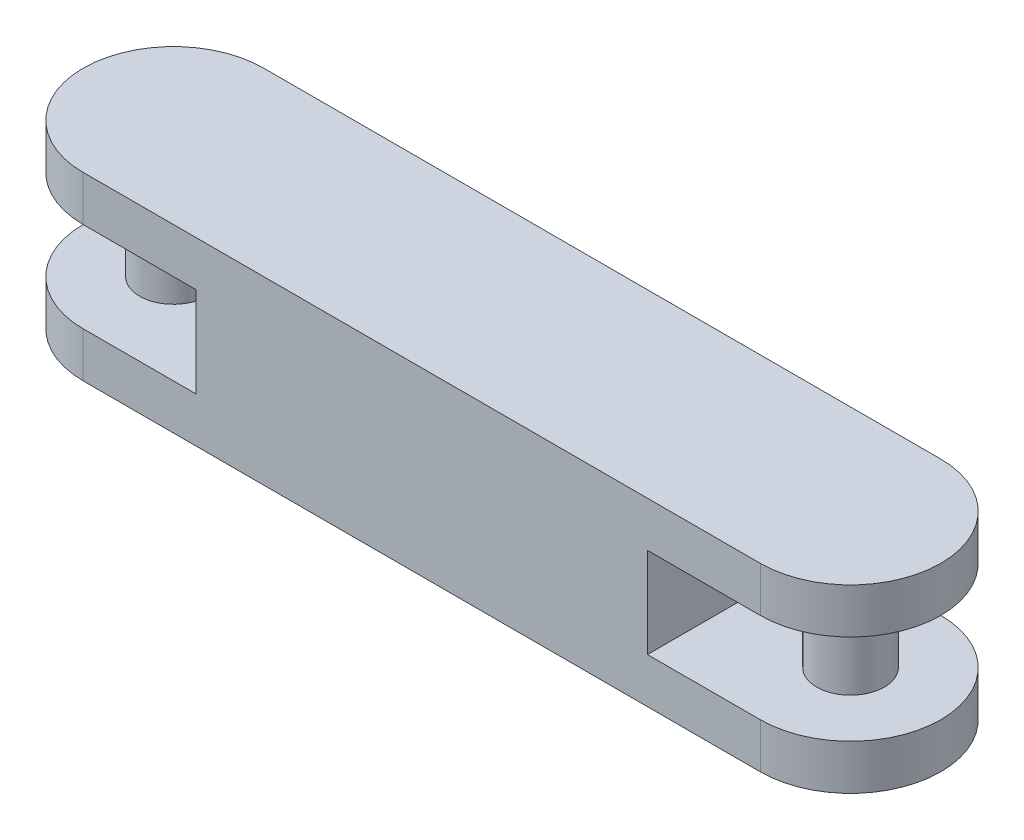
ISO-10303-21;
HEADER;
FILE_DESCRIPTION(('STEP AP214'),'2;1');
FILE_NAME('part.step','',(''),(''),'','','');
FILE_SCHEMA(('AUTOMOTIVE_DESIGN { 1 0 10303 214 1 1 1 1 }'));
ENDSEC;
DATA;
#1=APPLICATION_CONTEXT('core data for automotive mechanical design processes');
#2=APPLICATION_PROTOCOL_DEFINITION('international standard','automotive_design',2000,#1);
#3=PRODUCT_CONTEXT('',#1,'mechanical');
#4=PRODUCT('Part','Part','',(#3));
#5=PRODUCT_RELATED_PRODUCT_CATEGORY('part','',(#4));
#6=PRODUCT_DEFINITION_FORMATION('','',#4);
#7=PRODUCT_DEFINITION_CONTEXT('part definition',#1,'design');
#8=PRODUCT_DEFINITION('design','',#6,#7);
#9=PRODUCT_DEFINITION_SHAPE('','',#8);
#10=(LENGTH_UNIT() NAMED_UNIT(*) SI_UNIT(.MILLI.,.METRE.));
#11=(NAMED_UNIT(*) PLANE_ANGLE_UNIT() SI_UNIT($,.RADIAN.));
#12=(NAMED_UNIT(*) SI_UNIT($,.STERADIAN.) SOLID_ANGLE_UNIT());
#13=UNCERTAINTY_MEASURE_WITH_UNIT(LENGTH_MEASURE(1.E-05),#10,'distance_accuracy_value','');
#14=(GEOMETRIC_REPRESENTATION_CONTEXT(3) GLOBAL_UNCERTAINTY_ASSIGNED_CONTEXT((#13)) GLOBAL_UNIT_ASSIGNED_CONTEXT((#10,
#11,#12)) REPRESENTATION_CONTEXT('',''));
#15=CARTESIAN_POINT('',(0.,0.,0.));
#16=DIRECTION('',(0.,0.,1.));
#17=DIRECTION('',(1.,0.,0.));
#18=AXIS2_PLACEMENT_3D('',#15,#16,#17);
#19=CARTESIAN_POINT('',(0.,40.,0.));
#20=DIRECTION('',(0.,-1.,0.));
#21=DIRECTION('',(0.,0.,-1.));
#22=AXIS2_PLACEMENT_3D('',#19,#20,#21);
#23=CYLINDRICAL_SURFACE('',#22,40.);
#24=CARTESIAN_POINT('',(0.,20.,0.));
#25=DIRECTION('',(0.,-1.,0.));
#26=DIRECTION('',(1.,0.,0.));
#27=AXIS2_PLACEMENT_3D('',#24,#25,#26);
#28=CIRCLE('',#27,40.);
#29=CARTESIAN_POINT('',(0.,20.,40.));
#30=VERTEX_POINT('',#29);
#31=CARTESIAN_POINT('',(0.,20.,-40.));
#32=VERTEX_POINT('',#31);
#33=EDGE_CURVE('E195',#30,#32,#28,.T.);
#34=ORIENTED_EDGE('',*,*,#33,.F.);
#35=DIRECTION('',(0.,-1.,0.));
#36=VECTOR('',#35,1.);
#37=CARTESIAN_POINT('',(0.,40.,40.));
#38=LINE('',#37,#36);
#39=CARTESIAN_POINT('',(0.,40.,40.));
#40=VERTEX_POINT('',#39);
#41=EDGE_CURVE('E158',#40,#30,#38,.T.);
#42=ORIENTED_EDGE('',*,*,#41,.F.);
#43=CARTESIAN_POINT('',(0.,40.,0.));
#44=DIRECTION('',(0.,1.,0.));
#45=DIRECTION('',(0.,0.,1.));
#46=AXIS2_PLACEMENT_3D('',#43,#44,#45);
#47=CIRCLE('',#46,40.);
#48=CARTESIAN_POINT('',(0.,40.,-40.));
#49=VERTEX_POINT('',#48);
#50=EDGE_CURVE('E175',#49,#40,#47,.T.);
#51=ORIENTED_EDGE('',*,*,#50,.F.);
#52=DIRECTION('',(0.,-1.,0.));
#53=VECTOR('',#52,1.);
#54=CARTESIAN_POINT('',(0.,40.,-40.));
#55=LINE('',#54,#53);
#56=EDGE_CURVE('E170',#49,#32,#55,.T.);
#57=ORIENTED_EDGE('',*,*,#56,.T.);
#58=EDGE_LOOP('',(#34,#42,#51,#57));
#59=FACE_BOUND('',#58,.T.);
#60=ADVANCED_FACE('F39',(#59),#23,.T.);
#61=CARTESIAN_POINT('',(300.,40.,0.));
#62=DIRECTION('',(0.,-1.,0.));
#63=DIRECTION('',(0.,0.,-1.));
#64=AXIS2_PLACEMENT_3D('',#61,#62,#63);
#65=CYLINDRICAL_SURFACE('',#64,40.);
#66=CARTESIAN_POINT('',(300.,-20.,0.));
#67=DIRECTION('',(0.,1.,0.));
#68=DIRECTION('',(-1.,0.,0.));
#69=AXIS2_PLACEMENT_3D('',#66,#67,#68);
#70=CIRCLE('',#69,40.);
#71=CARTESIAN_POINT('',(300.,-20.,40.));
#72=VERTEX_POINT('',#71);
#73=CARTESIAN_POINT('',(300.,-20.,-40.));
#74=VERTEX_POINT('',#73);
#75=EDGE_CURVE('E199',#72,#74,#70,.T.);
#76=ORIENTED_EDGE('',*,*,#75,.F.);
#77=DIRECTION('',(0.,-1.,0.));
#78=VECTOR('',#77,1.);
#79=CARTESIAN_POINT('',(300.,40.,40.));
#80=LINE('',#79,#78);
#81=CARTESIAN_POINT('',(300.,-40.,40.));
#82=VERTEX_POINT('',#81);
#83=EDGE_CURVE('E165',#72,#82,#80,.T.);
#84=ORIENTED_EDGE('',*,*,#83,.T.);
#85=CARTESIAN_POINT('',(300.,-40.,0.));
#86=DIRECTION('',(0.,1.,0.));
#87=DIRECTION('',(0.,0.,1.));
#88=AXIS2_PLACEMENT_3D('',#85,#86,#87);
#89=CIRCLE('',#88,40.);
#90=CARTESIAN_POINT('',(300.,-40.,-40.));
#91=VERTEX_POINT('',#90);
#92=EDGE_CURVE('E176',#82,#91,#89,.T.);
#93=ORIENTED_EDGE('',*,*,#92,.T.);
#94=DIRECTION('',(0.,-1.,0.));
#95=VECTOR('',#94,1.);
#96=CARTESIAN_POINT('',(300.,40.,-40.));
#97=LINE('',#96,#95);
#98=EDGE_CURVE('E169',#74,#91,#97,.T.);
#99=ORIENTED_EDGE('',*,*,#98,.F.);
#100=EDGE_LOOP('',(#76,#84,#93,#99));
#101=FACE_BOUND('',#100,.T.);
#102=ADVANCED_FACE('F244',(#101),#65,.T.);
#103=CARTESIAN_POINT('',(0.,-20.,40.));
#104=VERTEX_POINT('',#103);
#105=CARTESIAN_POINT('',(0.,-40.,40.));
#106=VERTEX_POINT('',#105);
#107=EDGE_CURVE('E161',#104,#106,#38,.T.);
#108=ORIENTED_EDGE('',*,*,#107,.F.);
#109=CARTESIAN_POINT('',(0.,-20.,0.));
#110=DIRECTION('',(0.,-1.,0.));
#111=DIRECTION('',(1.,0.,0.));
#112=AXIS2_PLACEMENT_3D('',#109,#110,#111);
#113=CIRCLE('',#112,40.);
#114=CARTESIAN_POINT('',(0.,-20.,-40.));
#115=VERTEX_POINT('',#114);
#116=EDGE_CURVE('E185',#104,#115,#113,.T.);
#117=ORIENTED_EDGE('',*,*,#116,.T.);
#118=CARTESIAN_POINT('',(0.,-40.,-40.));
#119=VERTEX_POINT('',#118);
#120=EDGE_CURVE('E147',#115,#119,#55,.T.);
#121=ORIENTED_EDGE('',*,*,#120,.T.);
#122=CARTESIAN_POINT('',(0.,-40.,0.));
#123=DIRECTION('',(0.,1.,0.));
#124=DIRECTION('',(0.,0.,1.));
#125=AXIS2_PLACEMENT_3D('',#122,#123,#124);
#126=CIRCLE('',#125,40.);
#127=EDGE_CURVE('E182',#119,#106,#126,.T.);
#128=ORIENTED_EDGE('',*,*,#127,.T.);
#129=EDGE_LOOP('',(#108,#117,#121,#128));
#130=FACE_BOUND('',#129,.T.);
#131=ADVANCED_FACE('F41',(#130),#23,.T.);
#132=CARTESIAN_POINT('',(0.,40.,40.));
#133=DIRECTION('',(0.,0.,-1.));
#134=DIRECTION('',(-1.,0.,0.));
#135=AXIS2_PLACEMENT_3D('',#132,#133,#134);
#136=PLANE('',#135);
#137=DIRECTION('',(0.,-1.,0.));
#138=VECTOR('',#137,1.);
#139=CARTESIAN_POINT('',(50.,20.,40.));
#140=LINE('',#139,#138);
#141=CARTESIAN_POINT('',(50.,20.,40.));
#142=VERTEX_POINT('',#141);
#143=CARTESIAN_POINT('',(50.,-20.,40.));
#144=VERTEX_POINT('',#143);
#145=EDGE_CURVE('E219',#142,#144,#140,.T.);
#146=ORIENTED_EDGE('',*,*,#145,.T.);
#147=DIRECTION('',(1.,0.,0.));
#148=VECTOR('',#147,1.);
#149=CARTESIAN_POINT('',(-40.,-20.,40.));
#150=LINE('',#149,#148);
#151=EDGE_CURVE('E143',#104,#144,#150,.T.);
#152=ORIENTED_EDGE('',*,*,#151,.F.);
#153=ORIENTED_EDGE('',*,*,#107,.T.);
#154=DIRECTION('',(1.,0.,0.));
#155=VECTOR('',#154,1.);
#156=CARTESIAN_POINT('',(0.,-40.,40.));
#157=LINE('',#156,#155);
#158=EDGE_CURVE('E179',#106,#82,#157,.T.);
#159=ORIENTED_EDGE('',*,*,#158,.T.);
#160=ORIENTED_EDGE('',*,*,#83,.F.);
#161=DIRECTION('',(-1.,0.,0.));
#162=VECTOR('',#161,1.);
#163=CARTESIAN_POINT('',(340.,-20.,40.));
#164=LINE('',#163,#162);
#165=CARTESIAN_POINT('',(250.,-20.,40.));
#166=VERTEX_POINT('',#165);
#167=EDGE_CURVE('E206',#72,#166,#164,.T.);
#168=ORIENTED_EDGE('',*,*,#167,.T.);
#169=DIRECTION('',(0.,1.,0.));
#170=VECTOR('',#169,1.);
#171=CARTESIAN_POINT('',(250.,-20.,40.));
#172=LINE('',#171,#170);
#173=CARTESIAN_POINT('',(250.,20.,40.));
#174=VERTEX_POINT('',#173);
#175=EDGE_CURVE('E209',#166,#174,#172,.T.);
#176=ORIENTED_EDGE('',*,*,#175,.T.);
#177=DIRECTION('',(-1.,0.,0.));
#178=VECTOR('',#177,1.);
#179=CARTESIAN_POINT('',(340.,20.,40.));
#180=LINE('',#179,#178);
#181=CARTESIAN_POINT('',(300.,20.,40.));
#182=VERTEX_POINT('',#181);
#183=EDGE_CURVE('E212',#182,#174,#180,.T.);
#184=ORIENTED_EDGE('',*,*,#183,.F.);
#185=CARTESIAN_POINT('',(300.,40.,40.));
#186=VERTEX_POINT('',#185);
#187=EDGE_CURVE('E162',#186,#182,#80,.T.);
#188=ORIENTED_EDGE('',*,*,#187,.F.);
#189=DIRECTION('',(1.,0.,0.));
#190=VECTOR('',#189,1.);
#191=CARTESIAN_POINT('',(0.,40.,40.));
#192=LINE('',#191,#190);
#193=EDGE_CURVE('E190',#40,#186,#192,.T.);
#194=ORIENTED_EDGE('',*,*,#193,.F.);
#195=ORIENTED_EDGE('',*,*,#41,.T.);
#196=DIRECTION('',(1.,0.,0.));
#197=VECTOR('',#196,1.);
#198=CARTESIAN_POINT('',(-40.,20.,40.));
#199=LINE('',#198,#197);
#200=EDGE_CURVE('E135',#30,#142,#199,.T.);
#201=ORIENTED_EDGE('',*,*,#200,.T.);
#202=EDGE_LOOP('',(#146,#152,#153,#159,#160,#168,#176,#184,#188,#194,#195,#201));
#203=FACE_BOUND('',#202,.T.);
#204=ADVANCED_FACE('F254',(#203),#136,.F.);
#205=ORIENTED_EDGE('',*,*,#187,.T.);
#206=CARTESIAN_POINT('',(300.,20.,0.));
#207=DIRECTION('',(0.,1.,0.));
#208=DIRECTION('',(-1.,0.,0.));
#209=AXIS2_PLACEMENT_3D('',#206,#207,#208);
#210=CIRCLE('',#209,40.);
#211=CARTESIAN_POINT('',(300.,20.,-40.));
#212=VERTEX_POINT('',#211);
#213=EDGE_CURVE('E197',#182,#212,#210,.T.);
#214=ORIENTED_EDGE('',*,*,#213,.T.);
#215=CARTESIAN_POINT('',(300.,40.,-40.));
#216=VERTEX_POINT('',#215);
#217=EDGE_CURVE('E166',#216,#212,#97,.T.);
#218=ORIENTED_EDGE('',*,*,#217,.F.);
#219=CARTESIAN_POINT('',(300.,40.,0.));
#220=DIRECTION('',(0.,1.,0.));
#221=DIRECTION('',(0.,0.,1.));
#222=AXIS2_PLACEMENT_3D('',#219,#220,#221);
#223=CIRCLE('',#222,40.);
#224=EDGE_CURVE('E188',#186,#216,#223,.T.);
#225=ORIENTED_EDGE('',*,*,#224,.F.);
#226=EDGE_LOOP('',(#205,#214,#218,#225));
#227=FACE_BOUND('',#226,.T.);
#228=ADVANCED_FACE('F251',(#227),#65,.T.);
#229=CARTESIAN_POINT('',(0.,40.,-40.));
#230=DIRECTION('',(0.,0.,1.));
#231=DIRECTION('',(1.,0.,0.));
#232=AXIS2_PLACEMENT_3D('',#229,#230,#231);
#233=PLANE('',#232);
#234=ORIENTED_EDGE('',*,*,#120,.F.);
#235=DIRECTION('',(1.,0.,0.));
#236=VECTOR('',#235,1.);
#237=CARTESIAN_POINT('',(0.,-20.,-40.));
#238=LINE('',#237,#236);
#239=CARTESIAN_POINT('',(50.,-20.,-40.));
#240=VERTEX_POINT('',#239);
#241=EDGE_CURVE('E140',#115,#240,#238,.T.);
#242=ORIENTED_EDGE('',*,*,#241,.T.);
#243=DIRECTION('',(0.,-1.,0.));
#244=VECTOR('',#243,1.);
#245=CARTESIAN_POINT('',(50.,20.,-40.));
#246=LINE('',#245,#244);
#247=CARTESIAN_POINT('',(50.,20.,-40.));
#248=VERTEX_POINT('',#247);
#249=EDGE_CURVE('E127',#248,#240,#246,.T.);
#250=ORIENTED_EDGE('',*,*,#249,.F.);
#251=DIRECTION('',(1.,0.,0.));
#252=VECTOR('',#251,1.);
#253=CARTESIAN_POINT('',(0.,20.,-40.));
#254=LINE('',#253,#252);
#255=EDGE_CURVE('E148',#32,#248,#254,.T.);
#256=ORIENTED_EDGE('',*,*,#255,.F.);
#257=ORIENTED_EDGE('',*,*,#56,.F.);
#258=DIRECTION('',(-1.,0.,0.));
#259=VECTOR('',#258,1.);
#260=CARTESIAN_POINT('',(0.,40.,-40.));
#261=LINE('',#260,#259);
#262=EDGE_CURVE('E186',#216,#49,#261,.T.);
#263=ORIENTED_EDGE('',*,*,#262,.F.);
#264=ORIENTED_EDGE('',*,*,#217,.T.);
#265=DIRECTION('',(-1.,0.,0.));
#266=VECTOR('',#265,1.);
#267=CARTESIAN_POINT('',(0.,20.,-40.));
#268=LINE('',#267,#266);
#269=CARTESIAN_POINT('',(250.,20.,-40.));
#270=VERTEX_POINT('',#269);
#271=EDGE_CURVE('E151',#212,#270,#268,.T.);
#272=ORIENTED_EDGE('',*,*,#271,.T.);
#273=DIRECTION('',(0.,1.,0.));
#274=VECTOR('',#273,1.);
#275=CARTESIAN_POINT('',(250.,-20.,-40.));
#276=LINE('',#275,#274);
#277=CARTESIAN_POINT('',(250.,-20.,-40.));
#278=VERTEX_POINT('',#277);
#279=EDGE_CURVE('E204',#278,#270,#276,.T.);
#280=ORIENTED_EDGE('',*,*,#279,.F.);
#281=DIRECTION('',(-1.,0.,0.));
#282=VECTOR('',#281,1.);
#283=CARTESIAN_POINT('',(0.,-20.,-40.));
#284=LINE('',#283,#282);
#285=EDGE_CURVE('E156',#74,#278,#284,.T.);
#286=ORIENTED_EDGE('',*,*,#285,.F.);
#287=ORIENTED_EDGE('',*,*,#98,.T.);
#288=DIRECTION('',(-1.,0.,0.));
#289=VECTOR('',#288,1.);
#290=CARTESIAN_POINT('',(0.,-40.,-40.));
#291=LINE('',#290,#289);
#292=EDGE_CURVE('E173',#91,#119,#291,.T.);
#293=ORIENTED_EDGE('',*,*,#292,.T.);
#294=EDGE_LOOP('',(#234,#242,#250,#256,#257,#263,#264,#272,#280,#286,#287,#293));
#295=FACE_BOUND('',#294,.T.);
#296=ADVANCED_FACE('F145',(#295),#233,.F.);
#297=CARTESIAN_POINT('',(0.,40.,0.));
#298=DIRECTION('',(0.,1.,0.));
#299=DIRECTION('',(0.,0.,1.));
#300=AXIS2_PLACEMENT_3D('',#297,#298,#299);
#301=PLANE('',#300);
#302=ORIENTED_EDGE('',*,*,#50,.T.);
#303=ORIENTED_EDGE('',*,*,#193,.T.);
#304=ORIENTED_EDGE('',*,*,#224,.T.);
#305=ORIENTED_EDGE('',*,*,#262,.T.);
#306=EDGE_LOOP('',(#302,#303,#304,#305));
#307=FACE_BOUND('',#306,.T.);
#308=ADVANCED_FACE('F289',(#307),#301,.T.);
#309=CARTESIAN_POINT('',(0.,-40.,0.));
#310=DIRECTION('',(0.,1.,0.));
#311=DIRECTION('',(0.,0.,1.));
#312=AXIS2_PLACEMENT_3D('',#309,#310,#311);
#313=PLANE('',#312);
#314=ORIENTED_EDGE('',*,*,#127,.F.);
#315=ORIENTED_EDGE('',*,*,#292,.F.);
#316=ORIENTED_EDGE('',*,*,#92,.F.);
#317=ORIENTED_EDGE('',*,*,#158,.F.);
#318=EDGE_LOOP('',(#314,#315,#316,#317));
#319=FACE_BOUND('',#318,.T.);
#320=ADVANCED_FACE('F266',(#319),#313,.F.);
#321=CARTESIAN_POINT('',(340.,20.,-40.));
#322=DIRECTION('',(0.,1.,0.));
#323=DIRECTION('',(-1.,0.,0.));
#324=AXIS2_PLACEMENT_3D('',#321,#322,#323);
#325=PLANE('',#324);
#326=CARTESIAN_POINT('',(300.,20.,0.));
#327=DIRECTION('',(0.,1.,0.));
#328=DIRECTION('',(-1.,0.,0.));
#329=AXIS2_PLACEMENT_3D('',#326,#327,#328);
#330=CIRCLE('',#329,15.);
#331=CARTESIAN_POINT('',(285.,20.,0.));
#332=VERTEX_POINT('',#331);
#333=EDGE_CURVE('E214',#332,#332,#330,.T.);
#334=ORIENTED_EDGE('',*,*,#333,.T.);
#335=EDGE_LOOP('',(#334));
#336=FACE_BOUND('',#335,.T.);
#337=ORIENTED_EDGE('',*,*,#183,.T.);
#338=DIRECTION('',(0.,0.,1.));
#339=VECTOR('',#338,1.);
#340=CARTESIAN_POINT('',(250.,20.,-40.));
#341=LINE('',#340,#339);
#342=EDGE_CURVE('E201',#270,#174,#341,.T.);
#343=ORIENTED_EDGE('',*,*,#342,.F.);
#344=ORIENTED_EDGE('',*,*,#271,.F.);
#345=ORIENTED_EDGE('',*,*,#213,.F.);
#346=EDGE_LOOP('',(#337,#343,#344,#345));
#347=FACE_BOUND('',#346,.T.);
#348=ADVANCED_FACE('F279',(#336,#347),#325,.F.);
#349=CARTESIAN_POINT('',(340.,-20.,-40.));
#350=DIRECTION('',(0.,1.,0.));
#351=DIRECTION('',(-1.,0.,0.));
#352=AXIS2_PLACEMENT_3D('',#349,#350,#351);
#353=PLANE('',#352);
#354=CARTESIAN_POINT('',(300.,-20.,0.));
#355=DIRECTION('',(0.,1.,0.));
#356=DIRECTION('',(-1.,0.,0.));
#357=AXIS2_PLACEMENT_3D('',#354,#355,#356);
#358=CIRCLE('',#357,15.);
#359=CARTESIAN_POINT('',(285.,-20.,0.));
#360=VERTEX_POINT('',#359);
#361=EDGE_CURVE('E11',#360,#360,#358,.T.);
#362=ORIENTED_EDGE('',*,*,#361,.F.);
#363=EDGE_LOOP('',(#362));
#364=FACE_BOUND('',#363,.T.);
#365=ORIENTED_EDGE('',*,*,#75,.T.);
#366=ORIENTED_EDGE('',*,*,#285,.T.);
#367=DIRECTION('',(0.,0.,1.));
#368=VECTOR('',#367,1.);
#369=CARTESIAN_POINT('',(250.,-20.,-40.));
#370=LINE('',#369,#368);
#371=EDGE_CURVE('E62',#278,#166,#370,.T.);
#372=ORIENTED_EDGE('',*,*,#371,.T.);
#373=ORIENTED_EDGE('',*,*,#167,.F.);
#374=EDGE_LOOP('',(#365,#366,#372,#373));
#375=FACE_BOUND('',#374,.T.);
#376=ADVANCED_FACE('F272',(#364,#375),#353,.T.);
#377=CARTESIAN_POINT('',(250.,-20.,-40.));
#378=DIRECTION('',(1.,0.,0.));
#379=DIRECTION('',(0.,0.,-1.));
#380=AXIS2_PLACEMENT_3D('',#377,#378,#379);
#381=PLANE('',#380);
#382=ORIENTED_EDGE('',*,*,#175,.F.);
#383=ORIENTED_EDGE('',*,*,#371,.F.);
#384=ORIENTED_EDGE('',*,*,#279,.T.);
#385=ORIENTED_EDGE('',*,*,#342,.T.);
#386=EDGE_LOOP('',(#382,#383,#384,#385));
#387=FACE_BOUND('',#386,.T.);
#388=ADVANCED_FACE('F275',(#387),#381,.T.);
#389=CARTESIAN_POINT('',(-40.,-20.,-40.));
#390=DIRECTION('',(0.,-1.,0.));
#391=DIRECTION('',(1.,0.,0.));
#392=AXIS2_PLACEMENT_3D('',#389,#390,#391);
#393=PLANE('',#392);
#394=CARTESIAN_POINT('',(0.,-20.,0.));
#395=DIRECTION('',(0.,-1.,0.));
#396=DIRECTION('',(1.,0.,0.));
#397=AXIS2_PLACEMENT_3D('',#394,#395,#396);
#398=CIRCLE('',#397,15.);
#399=CARTESIAN_POINT('',(15.,-20.,0.));
#400=VERTEX_POINT('',#399);
#401=EDGE_CURVE('E224',#400,#400,#398,.T.);
#402=ORIENTED_EDGE('',*,*,#401,.T.);
#403=EDGE_LOOP('',(#402));
#404=FACE_BOUND('',#403,.T.);
#405=ORIENTED_EDGE('',*,*,#151,.T.);
#406=DIRECTION('',(0.,0.,1.));
#407=VECTOR('',#406,1.);
#408=CARTESIAN_POINT('',(50.,-20.,-40.));
#409=LINE('',#408,#407);
#410=EDGE_CURVE('E130',#240,#144,#409,.T.);
#411=ORIENTED_EDGE('',*,*,#410,.F.);
#412=ORIENTED_EDGE('',*,*,#241,.F.);
#413=ORIENTED_EDGE('',*,*,#116,.F.);
#414=EDGE_LOOP('',(#405,#411,#412,#413));
#415=FACE_BOUND('',#414,.T.);
#416=ADVANCED_FACE('F139',(#404,#415),#393,.F.);
#417=CARTESIAN_POINT('',(-40.,20.,-40.));
#418=DIRECTION('',(0.,-1.,0.));
#419=DIRECTION('',(1.,0.,0.));
#420=AXIS2_PLACEMENT_3D('',#417,#418,#419);
#421=PLANE('',#420);
#422=CARTESIAN_POINT('',(0.,20.,0.));
#423=DIRECTION('',(0.,-1.,0.));
#424=DIRECTION('',(1.,0.,0.));
#425=AXIS2_PLACEMENT_3D('',#422,#423,#424);
#426=CIRCLE('',#425,15.);
#427=CARTESIAN_POINT('',(15.,20.,0.));
#428=VERTEX_POINT('',#427);
#429=EDGE_CURVE('E47',#428,#428,#426,.T.);
#430=ORIENTED_EDGE('',*,*,#429,.F.);
#431=EDGE_LOOP('',(#430));
#432=FACE_BOUND('',#431,.T.);
#433=ORIENTED_EDGE('',*,*,#33,.T.);
#434=ORIENTED_EDGE('',*,*,#255,.T.);
#435=DIRECTION('',(0.,0.,1.));
#436=VECTOR('',#435,1.);
#437=CARTESIAN_POINT('',(50.,20.,-40.));
#438=LINE('',#437,#436);
#439=EDGE_CURVE('E54',#248,#142,#438,.T.);
#440=ORIENTED_EDGE('',*,*,#439,.T.);
#441=ORIENTED_EDGE('',*,*,#200,.F.);
#442=EDGE_LOOP('',(#433,#434,#440,#441));
#443=FACE_BOUND('',#442,.T.);
#444=ADVANCED_FACE('F241',(#432,#443),#421,.T.);
#445=CARTESIAN_POINT('',(50.,20.,-40.));
#446=DIRECTION('',(-1.,0.,0.));
#447=DIRECTION('',(0.,-1.,0.));
#448=AXIS2_PLACEMENT_3D('',#445,#446,#447);
#449=PLANE('',#448);
#450=ORIENTED_EDGE('',*,*,#145,.F.);
#451=ORIENTED_EDGE('',*,*,#439,.F.);
#452=ORIENTED_EDGE('',*,*,#249,.T.);
#453=ORIENTED_EDGE('',*,*,#410,.T.);
#454=EDGE_LOOP('',(#450,#451,#452,#453));
#455=FACE_BOUND('',#454,.T.);
#456=ADVANCED_FACE('F129',(#455),#449,.T.);
#457=CARTESIAN_POINT('',(0.,82.4264068711929,0.));
#458=DIRECTION('',(0.,-1.,0.));
#459=DIRECTION('',(0.,0.,-1.));
#460=AXIS2_PLACEMENT_3D('',#457,#458,#459);
#461=CYLINDRICAL_SURFACE('',#460,15.);
#462=ORIENTED_EDGE('',*,*,#429,.T.);
#463=EDGE_LOOP('',(#462));
#464=FACE_BOUND('',#463,.T.);
#465=ORIENTED_EDGE('',*,*,#401,.F.);
#466=EDGE_LOOP('',(#465));
#467=FACE_BOUND('',#466,.T.);
#468=ADVANCED_FACE('F229',(#464,#467),#461,.T.);
#469=CARTESIAN_POINT('',(300.,82.4264068711929,0.));
#470=DIRECTION('',(0.,-1.,0.));
#471=DIRECTION('',(0.,0.,-1.));
#472=AXIS2_PLACEMENT_3D('',#469,#470,#471);
#473=CYLINDRICAL_SURFACE('',#472,15.);
#474=ORIENTED_EDGE('',*,*,#361,.T.);
#475=EDGE_LOOP('',(#474));
#476=FACE_BOUND('',#475,.T.);
#477=ORIENTED_EDGE('',*,*,#333,.F.);
#478=EDGE_LOOP('',(#477));
#479=FACE_BOUND('',#478,.T.);
#480=ADVANCED_FACE('F231',(#476,#479),#473,.T.);
#481=CLOSED_SHELL('',(#60,#102,#131,#204,#228,#296,#308,#320,#348,#376,#388,#416,#444,#456,#468,#480));
#482=MANIFOLD_SOLID_BREP('B2',#481);
#483=ADVANCED_BREP_SHAPE_REPRESENTATION('',(#18,#482),#14);
#484=SHAPE_DEFINITION_REPRESENTATION(#9,#483);
ENDSEC;
END-ISO-10303-21;
